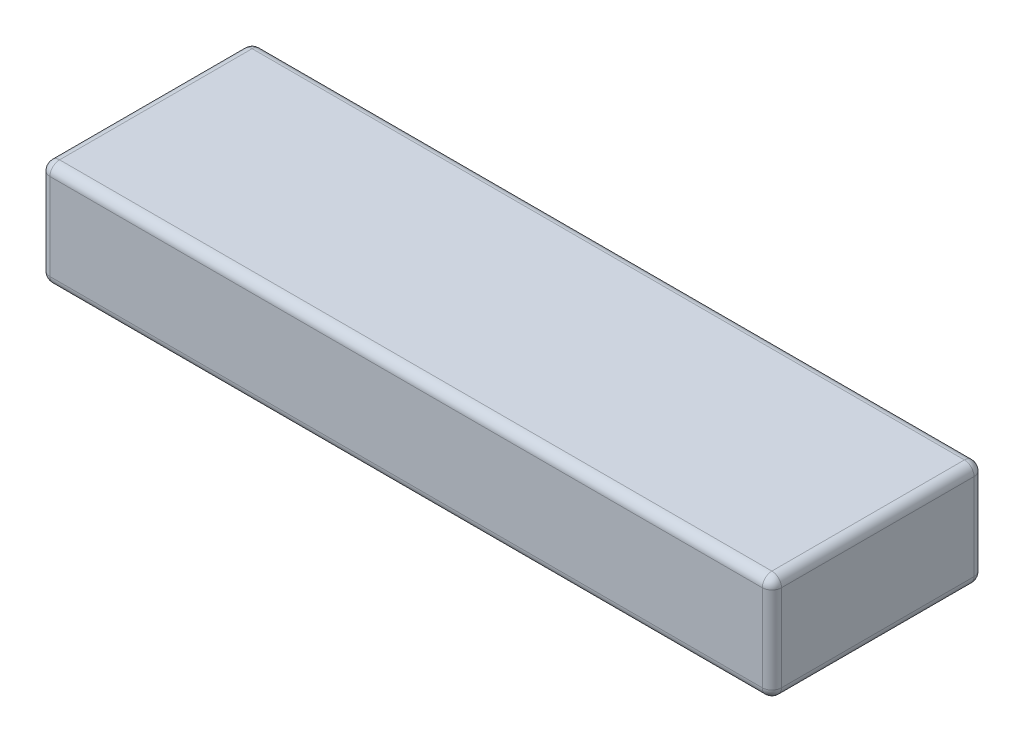
ISO-10303-21;
HEADER;
FILE_DESCRIPTION(('STEP AP214'),'2;1');
FILE_NAME('part.step','',(''),(''),'','','');
FILE_SCHEMA(('AUTOMOTIVE_DESIGN { 1 0 10303 214 1 1 1 1 }'));
ENDSEC;
DATA;
#1=APPLICATION_CONTEXT('core data for automotive mechanical design processes');
#2=APPLICATION_PROTOCOL_DEFINITION('international standard','automotive_design',2000,#1);
#3=PRODUCT_CONTEXT('',#1,'mechanical');
#4=PRODUCT('Part','Part','',(#3));
#5=PRODUCT_RELATED_PRODUCT_CATEGORY('part','',(#4));
#6=PRODUCT_DEFINITION_FORMATION('','',#4);
#7=PRODUCT_DEFINITION_CONTEXT('part definition',#1,'design');
#8=PRODUCT_DEFINITION('design','',#6,#7);
#9=PRODUCT_DEFINITION_SHAPE('','',#8);
#10=(LENGTH_UNIT() NAMED_UNIT(*) SI_UNIT(.MILLI.,.METRE.));
#11=(NAMED_UNIT(*) PLANE_ANGLE_UNIT() SI_UNIT($,.RADIAN.));
#12=(NAMED_UNIT(*) SI_UNIT($,.STERADIAN.) SOLID_ANGLE_UNIT());
#13=UNCERTAINTY_MEASURE_WITH_UNIT(LENGTH_MEASURE(1.E-05),#10,'distance_accuracy_value','');
#14=(GEOMETRIC_REPRESENTATION_CONTEXT(3) GLOBAL_UNCERTAINTY_ASSIGNED_CONTEXT((#13)) GLOBAL_UNIT_ASSIGNED_CONTEXT((#10,
#11,#12)) REPRESENTATION_CONTEXT('',''));
#15=CARTESIAN_POINT('',(0.,0.,0.));
#16=DIRECTION('',(0.,0.,1.));
#17=DIRECTION('',(1.,0.,0.));
#18=AXIS2_PLACEMENT_3D('',#15,#16,#17);
#19=CARTESIAN_POINT('',(76.,22.,22.));
#20=DIRECTION('',(-1.,0.,0.));
#21=DIRECTION('',(0.,0.,1.));
#22=AXIS2_PLACEMENT_3D('',#19,#20,#21);
#23=PLANE('',#22);
#24=DIRECTION('',(0.,0.,-1.));
#25=VECTOR('',#24,1.);
#26=CARTESIAN_POINT('',(76.,2.,-22.));
#27=LINE('',#26,#25);
#28=CARTESIAN_POINT('',(76.,2.,20.));
#29=VERTEX_POINT('',#28);
#30=CARTESIAN_POINT('',(76.,2.,-20.));
#31=VERTEX_POINT('',#30);
#32=EDGE_CURVE('E190',#29,#31,#27,.T.);
#33=ORIENTED_EDGE('',*,*,#32,.T.);
#34=DIRECTION('',(0.,-1.,0.));
#35=VECTOR('',#34,1.);
#36=CARTESIAN_POINT('',(76.,22.,-20.));
#37=LINE('',#36,#35);
#38=CARTESIAN_POINT('',(76.,20.,-20.));
#39=VERTEX_POINT('',#38);
#40=EDGE_CURVE('E193',#31,#39,#37,.F.);
#41=ORIENTED_EDGE('',*,*,#40,.T.);
#42=DIRECTION('',(0.,0.,-1.));
#43=VECTOR('',#42,1.);
#44=CARTESIAN_POINT('',(76.,20.,22.));
#45=LINE('',#44,#43);
#46=CARTESIAN_POINT('',(76.,20.,20.));
#47=VERTEX_POINT('',#46);
#48=EDGE_CURVE('E184',#39,#47,#45,.F.);
#49=ORIENTED_EDGE('',*,*,#48,.T.);
#50=DIRECTION('',(0.,-1.,0.));
#51=VECTOR('',#50,1.);
#52=CARTESIAN_POINT('',(76.,22.,20.));
#53=LINE('',#52,#51);
#54=EDGE_CURVE('E187',#47,#29,#53,.T.);
#55=ORIENTED_EDGE('',*,*,#54,.T.);
#56=EDGE_LOOP('',(#33,#41,#49,#55));
#57=FACE_BOUND('',#56,.T.);
#58=ADVANCED_FACE('F45',(#57),#23,.F.);
#59=CARTESIAN_POINT('',(-76.,22.,-22.));
#60=DIRECTION('',(0.,0.,1.));
#61=DIRECTION('',(1.,0.,0.));
#62=AXIS2_PLACEMENT_3D('',#59,#60,#61);
#63=PLANE('',#62);
#64=DIRECTION('',(0.,-1.,0.));
#65=VECTOR('',#64,1.);
#66=CARTESIAN_POINT('',(74.,22.,-22.));
#67=LINE('',#66,#65);
#68=CARTESIAN_POINT('',(74.,20.,-22.));
#69=VERTEX_POINT('',#68);
#70=CARTESIAN_POINT('',(74.,2.,-22.));
#71=VERTEX_POINT('',#70);
#72=EDGE_CURVE('E146',#69,#71,#67,.T.);
#73=ORIENTED_EDGE('',*,*,#72,.T.);
#74=DIRECTION('',(-1.,0.,0.));
#75=VECTOR('',#74,1.);
#76=CARTESIAN_POINT('',(-76.,2.,-22.));
#77=LINE('',#76,#75);
#78=CARTESIAN_POINT('',(-74.,2.,-22.));
#79=VERTEX_POINT('',#78);
#80=EDGE_CURVE('E141',#71,#79,#77,.T.);
#81=ORIENTED_EDGE('',*,*,#80,.T.);
#82=DIRECTION('',(0.,-1.,0.));
#83=VECTOR('',#82,1.);
#84=CARTESIAN_POINT('',(-74.,22.,-22.));
#85=LINE('',#84,#83);
#86=CARTESIAN_POINT('',(-74.,20.,-22.));
#87=VERTEX_POINT('',#86);
#88=EDGE_CURVE('E133',#79,#87,#85,.F.);
#89=ORIENTED_EDGE('',*,*,#88,.T.);
#90=DIRECTION('',(-1.,0.,0.));
#91=VECTOR('',#90,1.);
#92=CARTESIAN_POINT('',(-76.,20.,-22.));
#93=LINE('',#92,#91);
#94=EDGE_CURVE('E138',#87,#69,#93,.F.);
#95=ORIENTED_EDGE('',*,*,#94,.T.);
#96=EDGE_LOOP('',(#73,#81,#89,#95));
#97=FACE_BOUND('',#96,.T.);
#98=ADVANCED_FACE('F136',(#97),#63,.F.);
#99=CARTESIAN_POINT('',(-76.,22.,22.));
#100=DIRECTION('',(1.,0.,0.));
#101=DIRECTION('',(0.,0.,-1.));
#102=AXIS2_PLACEMENT_3D('',#99,#100,#101);
#103=PLANE('',#102);
#104=DIRECTION('',(0.,0.,1.));
#105=VECTOR('',#104,1.);
#106=CARTESIAN_POINT('',(-76.,20.,22.));
#107=LINE('',#106,#105);
#108=CARTESIAN_POINT('',(-76.,20.,20.));
#109=VERTEX_POINT('',#108);
#110=CARTESIAN_POINT('',(-76.,20.,-20.));
#111=VERTEX_POINT('',#110);
#112=EDGE_CURVE('E197',#109,#111,#107,.F.);
#113=ORIENTED_EDGE('',*,*,#112,.T.);
#114=DIRECTION('',(0.,-1.,0.));
#115=VECTOR('',#114,1.);
#116=CARTESIAN_POINT('',(-76.,22.,-20.));
#117=LINE('',#116,#115);
#118=CARTESIAN_POINT('',(-76.,2.,-20.));
#119=VERTEX_POINT('',#118);
#120=EDGE_CURVE('E154',#111,#119,#117,.T.);
#121=ORIENTED_EDGE('',*,*,#120,.T.);
#122=DIRECTION('',(0.,0.,1.));
#123=VECTOR('',#122,1.);
#124=CARTESIAN_POINT('',(-76.,2.,22.));
#125=LINE('',#124,#123);
#126=CARTESIAN_POINT('',(-76.,2.,20.));
#127=VERTEX_POINT('',#126);
#128=EDGE_CURVE('E203',#119,#127,#125,.T.);
#129=ORIENTED_EDGE('',*,*,#128,.T.);
#130=DIRECTION('',(0.,-1.,0.));
#131=VECTOR('',#130,1.);
#132=CARTESIAN_POINT('',(-76.,22.,20.));
#133=LINE('',#132,#131);
#134=EDGE_CURVE('E200',#127,#109,#133,.F.);
#135=ORIENTED_EDGE('',*,*,#134,.T.);
#136=EDGE_LOOP('',(#113,#121,#129,#135));
#137=FACE_BOUND('',#136,.T.);
#138=ADVANCED_FACE('F384',(#137),#103,.F.);
#139=CARTESIAN_POINT('',(-76.,22.,22.));
#140=DIRECTION('',(0.,0.,-1.));
#141=DIRECTION('',(-1.,0.,0.));
#142=AXIS2_PLACEMENT_3D('',#139,#140,#141);
#143=PLANE('',#142);
#144=DIRECTION('',(0.,-1.,0.));
#145=VECTOR('',#144,1.);
#146=CARTESIAN_POINT('',(-74.,22.,22.));
#147=LINE('',#146,#145);
#148=CARTESIAN_POINT('',(-74.,20.,22.));
#149=VERTEX_POINT('',#148);
#150=CARTESIAN_POINT('',(-74.,2.,22.));
#151=VERTEX_POINT('',#150);
#152=EDGE_CURVE('E227',#149,#151,#147,.T.);
#153=ORIENTED_EDGE('',*,*,#152,.T.);
#154=DIRECTION('',(1.,0.,0.));
#155=VECTOR('',#154,1.);
#156=CARTESIAN_POINT('',(76.,2.,22.));
#157=LINE('',#156,#155);
#158=CARTESIAN_POINT('',(74.,2.,22.));
#159=VERTEX_POINT('',#158);
#160=EDGE_CURVE('E231',#151,#159,#157,.T.);
#161=ORIENTED_EDGE('',*,*,#160,.T.);
#162=DIRECTION('',(0.,-1.,0.));
#163=VECTOR('',#162,1.);
#164=CARTESIAN_POINT('',(74.,22.,22.));
#165=LINE('',#164,#163);
#166=CARTESIAN_POINT('',(74.,20.,22.));
#167=VERTEX_POINT('',#166);
#168=EDGE_CURVE('E224',#159,#167,#165,.F.);
#169=ORIENTED_EDGE('',*,*,#168,.T.);
#170=DIRECTION('',(1.,0.,0.));
#171=VECTOR('',#170,1.);
#172=CARTESIAN_POINT('',(-76.,20.,22.));
#173=LINE('',#172,#171);
#174=EDGE_CURVE('E221',#167,#149,#173,.F.);
#175=ORIENTED_EDGE('',*,*,#174,.T.);
#176=EDGE_LOOP('',(#153,#161,#169,#175));
#177=FACE_BOUND('',#176,.T.);
#178=ADVANCED_FACE('F333',(#177),#143,.F.);
#179=CARTESIAN_POINT('',(0.,22.,0.));
#180=DIRECTION('',(0.,-1.,0.));
#181=DIRECTION('',(0.,0.,-1.));
#182=AXIS2_PLACEMENT_3D('',#179,#180,#181);
#183=PLANE('',#182);
#184=DIRECTION('',(0.,0.,1.));
#185=VECTOR('',#184,1.);
#186=CARTESIAN_POINT('',(-74.,22.,0.));
#187=LINE('',#186,#185);
#188=CARTESIAN_POINT('',(-74.,22.,-20.));
#189=VERTEX_POINT('',#188);
#190=CARTESIAN_POINT('',(-74.,22.,20.));
#191=VERTEX_POINT('',#190);
#192=EDGE_CURVE('E55',#189,#191,#187,.T.);
#193=ORIENTED_EDGE('',*,*,#192,.T.);
#194=DIRECTION('',(1.,0.,0.));
#195=VECTOR('',#194,1.);
#196=CARTESIAN_POINT('',(0.,22.,20.));
#197=LINE('',#196,#195);
#198=CARTESIAN_POINT('',(74.,22.,20.));
#199=VERTEX_POINT('',#198);
#200=EDGE_CURVE('E11',#191,#199,#197,.T.);
#201=ORIENTED_EDGE('',*,*,#200,.T.);
#202=DIRECTION('',(0.,0.,-1.));
#203=VECTOR('',#202,1.);
#204=CARTESIAN_POINT('',(74.,22.,0.));
#205=LINE('',#204,#203);
#206=CARTESIAN_POINT('',(74.,22.,-20.));
#207=VERTEX_POINT('',#206);
#208=EDGE_CURVE('E234',#199,#207,#205,.T.);
#209=ORIENTED_EDGE('',*,*,#208,.T.);
#210=DIRECTION('',(-1.,0.,0.));
#211=VECTOR('',#210,1.);
#212=CARTESIAN_POINT('',(0.,22.,-20.));
#213=LINE('',#212,#211);
#214=EDGE_CURVE('E66',#207,#189,#213,.T.);
#215=ORIENTED_EDGE('',*,*,#214,.T.);
#216=EDGE_LOOP('',(#193,#201,#209,#215));
#217=FACE_BOUND('',#216,.T.);
#218=ADVANCED_FACE('F348',(#217),#183,.F.);
#219=CARTESIAN_POINT('',(0.,0.,0.));
#220=DIRECTION('',(0.,-1.,0.));
#221=DIRECTION('',(0.,0.,-1.));
#222=AXIS2_PLACEMENT_3D('',#219,#220,#221);
#223=PLANE('',#222);
#224=DIRECTION('',(0.,0.,1.));
#225=VECTOR('',#224,1.);
#226=CARTESIAN_POINT('',(-74.,0.,-22.));
#227=LINE('',#226,#225);
#228=CARTESIAN_POINT('',(-74.,0.,20.));
#229=VERTEX_POINT('',#228);
#230=CARTESIAN_POINT('',(-74.,0.,-20.));
#231=VERTEX_POINT('',#230);
#232=EDGE_CURVE('E214',#229,#231,#227,.F.);
#233=ORIENTED_EDGE('',*,*,#232,.T.);
#234=DIRECTION('',(-1.,0.,0.));
#235=VECTOR('',#234,1.);
#236=CARTESIAN_POINT('',(76.,0.,-20.));
#237=LINE('',#236,#235);
#238=CARTESIAN_POINT('',(74.,0.,-20.));
#239=VERTEX_POINT('',#238);
#240=EDGE_CURVE('E217',#231,#239,#237,.F.);
#241=ORIENTED_EDGE('',*,*,#240,.T.);
#242=DIRECTION('',(0.,0.,-1.));
#243=VECTOR('',#242,1.);
#244=CARTESIAN_POINT('',(74.,0.,22.));
#245=LINE('',#244,#243);
#246=CARTESIAN_POINT('',(74.,0.,20.));
#247=VERTEX_POINT('',#246);
#248=EDGE_CURVE('E211',#239,#247,#245,.F.);
#249=ORIENTED_EDGE('',*,*,#248,.T.);
#250=DIRECTION('',(1.,0.,0.));
#251=VECTOR('',#250,1.);
#252=CARTESIAN_POINT('',(-76.,0.,20.));
#253=LINE('',#252,#251);
#254=EDGE_CURVE('E208',#247,#229,#253,.F.);
#255=ORIENTED_EDGE('',*,*,#254,.T.);
#256=EDGE_LOOP('',(#233,#241,#249,#255));
#257=FACE_BOUND('',#256,.T.);
#258=ADVANCED_FACE('F324',(#257),#223,.T.);
#259=CARTESIAN_POINT('',(-74.,22.,20.));
#260=DIRECTION('',(0.,-1.,0.));
#261=DIRECTION('',(0.,0.,-1.));
#262=AXIS2_PLACEMENT_3D('',#259,#260,#261);
#263=CYLINDRICAL_SURFACE('',#262,2.);
#264=CARTESIAN_POINT('',(-74.,20.,20.));
#265=DIRECTION('',(0.,1.,0.));
#266=DIRECTION('',(0.,0.,1.));
#267=AXIS2_PLACEMENT_3D('',#264,#265,#266);
#268=CIRCLE('',#267,2.);
#269=EDGE_CURVE('E49',#109,#149,#268,.T.);
#270=ORIENTED_EDGE('',*,*,#269,.F.);
#271=ORIENTED_EDGE('',*,*,#134,.F.);
#272=CARTESIAN_POINT('',(-74.,2.,20.));
#273=DIRECTION('',(0.,-1.,0.));
#274=DIRECTION('',(0.,0.,-1.));
#275=AXIS2_PLACEMENT_3D('',#272,#273,#274);
#276=CIRCLE('',#275,2.);
#277=EDGE_CURVE('E178',#151,#127,#276,.T.);
#278=ORIENTED_EDGE('',*,*,#277,.F.);
#279=ORIENTED_EDGE('',*,*,#152,.F.);
#280=EDGE_LOOP('',(#270,#271,#278,#279));
#281=FACE_BOUND('',#280,.T.);
#282=ADVANCED_FACE('F47',(#281),#263,.T.);
#283=CARTESIAN_POINT('',(-74.,20.,20.));
#284=DIRECTION('',(0.,0.,1.));
#285=DIRECTION('',(1.,0.,0.));
#286=AXIS2_PLACEMENT_3D('',#283,#284,#285);
#287=SPHERICAL_SURFACE('',#286,2.);
#288=CARTESIAN_POINT('',(-74.,20.,20.));
#289=DIRECTION('',(0.,0.,1.));
#290=DIRECTION('',(1.,0.,0.));
#291=AXIS2_PLACEMENT_3D('',#288,#289,#290);
#292=CIRCLE('',#291,2.);
#293=EDGE_CURVE('E301',#109,#191,#292,.F.);
#294=ORIENTED_EDGE('',*,*,#293,.F.);
#295=ORIENTED_EDGE('',*,*,#269,.T.);
#296=CARTESIAN_POINT('',(-74.,20.,20.));
#297=DIRECTION('',(-1.,0.,0.));
#298=DIRECTION('',(0.,0.,1.));
#299=AXIS2_PLACEMENT_3D('',#296,#297,#298);
#300=CIRCLE('',#299,2.);
#301=EDGE_CURVE('E304',#191,#149,#300,.F.);
#302=ORIENTED_EDGE('',*,*,#301,.F.);
#303=EDGE_LOOP('',(#294,#295,#302));
#304=FACE_BOUND('',#303,.T.);
#305=ADVANCED_FACE('F552',(#304),#287,.T.);
#306=CARTESIAN_POINT('',(-74.,2.,20.));
#307=DIRECTION('',(-1.,0.,0.));
#308=DIRECTION('',(0.,-1.,0.));
#309=AXIS2_PLACEMENT_3D('',#306,#307,#308);
#310=SPHERICAL_SURFACE('',#309,2.);
#311=CARTESIAN_POINT('',(-74.,2.,20.));
#312=DIRECTION('',(-1.,0.,0.));
#313=DIRECTION('',(0.,0.,1.));
#314=AXIS2_PLACEMENT_3D('',#311,#312,#313);
#315=CIRCLE('',#314,2.);
#316=EDGE_CURVE('E293',#151,#229,#315,.F.);
#317=ORIENTED_EDGE('',*,*,#316,.F.);
#318=ORIENTED_EDGE('',*,*,#277,.T.);
#319=CARTESIAN_POINT('',(-74.,2.,20.));
#320=DIRECTION('',(0.,0.,1.));
#321=DIRECTION('',(1.,0.,0.));
#322=AXIS2_PLACEMENT_3D('',#319,#320,#321);
#323=CIRCLE('',#322,2.);
#324=EDGE_CURVE('E297',#229,#127,#323,.F.);
#325=ORIENTED_EDGE('',*,*,#324,.F.);
#326=EDGE_LOOP('',(#317,#318,#325));
#327=FACE_BOUND('',#326,.T.);
#328=ADVANCED_FACE('F313',(#327),#310,.T.);
#329=CARTESIAN_POINT('',(0.,20.,20.));
#330=DIRECTION('',(1.,0.,0.));
#331=DIRECTION('',(0.,0.,-1.));
#332=AXIS2_PLACEMENT_3D('',#329,#330,#331);
#333=CYLINDRICAL_SURFACE('',#332,2.);
#334=ORIENTED_EDGE('',*,*,#301,.T.);
#335=ORIENTED_EDGE('',*,*,#174,.F.);
#336=CARTESIAN_POINT('',(74.,20.,20.));
#337=DIRECTION('',(1.,0.,0.));
#338=DIRECTION('',(0.,0.,-1.));
#339=AXIS2_PLACEMENT_3D('',#336,#337,#338);
#340=CIRCLE('',#339,2.);
#341=EDGE_CURVE('E285',#199,#167,#340,.T.);
#342=ORIENTED_EDGE('',*,*,#341,.F.);
#343=ORIENTED_EDGE('',*,*,#200,.F.);
#344=EDGE_LOOP('',(#334,#335,#342,#343));
#345=FACE_BOUND('',#344,.T.);
#346=ADVANCED_FACE('F347',(#345),#333,.T.);
#347=CARTESIAN_POINT('',(-74.,20.,0.));
#348=DIRECTION('',(0.,0.,1.));
#349=DIRECTION('',(1.,0.,0.));
#350=AXIS2_PLACEMENT_3D('',#347,#348,#349);
#351=CYLINDRICAL_SURFACE('',#350,2.);
#352=ORIENTED_EDGE('',*,*,#293,.T.);
#353=ORIENTED_EDGE('',*,*,#192,.F.);
#354=CARTESIAN_POINT('',(-74.,20.,-20.));
#355=DIRECTION('',(0.,0.,-1.));
#356=DIRECTION('',(0.,1.,0.));
#357=AXIS2_PLACEMENT_3D('',#354,#355,#356);
#358=CIRCLE('',#357,2.);
#359=EDGE_CURVE('E159',#111,#189,#358,.T.);
#360=ORIENTED_EDGE('',*,*,#359,.F.);
#361=ORIENTED_EDGE('',*,*,#112,.F.);
#362=EDGE_LOOP('',(#352,#353,#360,#361));
#363=FACE_BOUND('',#362,.T.);
#364=ADVANCED_FACE('F523',(#363),#351,.T.);
#365=CARTESIAN_POINT('',(-74.,22.,-20.));
#366=DIRECTION('',(0.,-1.,0.));
#367=DIRECTION('',(0.,0.,-1.));
#368=AXIS2_PLACEMENT_3D('',#365,#366,#367);
#369=CYLINDRICAL_SURFACE('',#368,2.);
#370=CARTESIAN_POINT('',(-74.,2.,-20.));
#371=DIRECTION('',(0.,-1.,0.));
#372=DIRECTION('',(0.,0.,-1.));
#373=AXIS2_PLACEMENT_3D('',#370,#371,#372);
#374=CIRCLE('',#373,2.);
#375=EDGE_CURVE('E160',#119,#79,#374,.T.);
#376=ORIENTED_EDGE('',*,*,#375,.F.);
#377=ORIENTED_EDGE('',*,*,#120,.F.);
#378=CARTESIAN_POINT('',(-74.,20.,-20.));
#379=DIRECTION('',(0.,1.,0.));
#380=DIRECTION('',(0.,0.,1.));
#381=AXIS2_PLACEMENT_3D('',#378,#379,#380);
#382=CIRCLE('',#381,2.);
#383=EDGE_CURVE('E150',#87,#111,#382,.T.);
#384=ORIENTED_EDGE('',*,*,#383,.F.);
#385=ORIENTED_EDGE('',*,*,#88,.F.);
#386=EDGE_LOOP('',(#376,#377,#384,#385));
#387=FACE_BOUND('',#386,.T.);
#388=ADVANCED_FACE('F152',(#387),#369,.T.);
#389=CARTESIAN_POINT('',(-74.,2.,22.));
#390=DIRECTION('',(0.,0.,-1.));
#391=DIRECTION('',(-1.,0.,0.));
#392=AXIS2_PLACEMENT_3D('',#389,#390,#391);
#393=CYLINDRICAL_SURFACE('',#392,2.);
#394=ORIENTED_EDGE('',*,*,#324,.T.);
#395=ORIENTED_EDGE('',*,*,#128,.F.);
#396=CARTESIAN_POINT('',(-74.,2.,-20.));
#397=DIRECTION('',(0.,0.,-1.));
#398=DIRECTION('',(-1.,0.,0.));
#399=AXIS2_PLACEMENT_3D('',#396,#397,#398);
#400=CIRCLE('',#399,2.);
#401=EDGE_CURVE('E278',#231,#119,#400,.T.);
#402=ORIENTED_EDGE('',*,*,#401,.F.);
#403=ORIENTED_EDGE('',*,*,#232,.F.);
#404=EDGE_LOOP('',(#394,#395,#402,#403));
#405=FACE_BOUND('',#404,.T.);
#406=ADVANCED_FACE('F320',(#405),#393,.T.);
#407=CARTESIAN_POINT('',(-76.,2.,20.));
#408=DIRECTION('',(-1.,0.,0.));
#409=DIRECTION('',(0.,0.,1.));
#410=AXIS2_PLACEMENT_3D('',#407,#408,#409);
#411=CYLINDRICAL_SURFACE('',#410,2.);
#412=ORIENTED_EDGE('',*,*,#316,.T.);
#413=ORIENTED_EDGE('',*,*,#254,.F.);
#414=CARTESIAN_POINT('',(74.,2.,20.));
#415=DIRECTION('',(1.,0.,0.));
#416=DIRECTION('',(0.,0.,-1.));
#417=AXIS2_PLACEMENT_3D('',#414,#415,#416);
#418=CIRCLE('',#417,2.);
#419=EDGE_CURVE('E274',#159,#247,#418,.T.);
#420=ORIENTED_EDGE('',*,*,#419,.F.);
#421=ORIENTED_EDGE('',*,*,#160,.F.);
#422=EDGE_LOOP('',(#412,#413,#420,#421));
#423=FACE_BOUND('',#422,.T.);
#424=ADVANCED_FACE('F330',(#423),#411,.T.);
#425=CARTESIAN_POINT('',(74.,22.,20.));
#426=DIRECTION('',(0.,-1.,0.));
#427=DIRECTION('',(0.,0.,-1.));
#428=AXIS2_PLACEMENT_3D('',#425,#426,#427);
#429=CYLINDRICAL_SURFACE('',#428,2.);
#430=CARTESIAN_POINT('',(74.,20.,20.));
#431=DIRECTION('',(0.,1.,0.));
#432=DIRECTION('',(0.,0.,1.));
#433=AXIS2_PLACEMENT_3D('',#430,#431,#432);
#434=CIRCLE('',#433,2.);
#435=EDGE_CURVE('E289',#167,#47,#434,.T.);
#436=ORIENTED_EDGE('',*,*,#435,.F.);
#437=ORIENTED_EDGE('',*,*,#168,.F.);
#438=CARTESIAN_POINT('',(74.,2.,20.));
#439=DIRECTION('',(0.,-1.,0.));
#440=DIRECTION('',(0.,0.,-1.));
#441=AXIS2_PLACEMENT_3D('',#438,#439,#440);
#442=CIRCLE('',#441,2.);
#443=EDGE_CURVE('E270',#29,#159,#442,.T.);
#444=ORIENTED_EDGE('',*,*,#443,.F.);
#445=ORIENTED_EDGE('',*,*,#54,.F.);
#446=EDGE_LOOP('',(#436,#437,#444,#445));
#447=FACE_BOUND('',#446,.T.);
#448=ADVANCED_FACE('F338',(#447),#429,.T.);
#449=CARTESIAN_POINT('',(74.,20.,20.));
#450=DIRECTION('',(0.,0.,1.));
#451=DIRECTION('',(1.,0.,0.));
#452=AXIS2_PLACEMENT_3D('',#449,#450,#451);
#453=SPHERICAL_SURFACE('',#452,2.);
#454=ORIENTED_EDGE('',*,*,#341,.T.);
#455=ORIENTED_EDGE('',*,*,#435,.T.);
#456=CARTESIAN_POINT('',(74.,20.,20.));
#457=DIRECTION('',(0.,0.,1.));
#458=DIRECTION('',(1.,0.,0.));
#459=AXIS2_PLACEMENT_3D('',#456,#457,#458);
#460=CIRCLE('',#459,2.);
#461=EDGE_CURVE('E167',#199,#47,#460,.F.);
#462=ORIENTED_EDGE('',*,*,#461,.F.);
#463=EDGE_LOOP('',(#454,#455,#462));
#464=FACE_BOUND('',#463,.T.);
#465=ADVANCED_FACE('F344',(#464),#453,.T.);
#466=CARTESIAN_POINT('',(-74.,20.,-20.));
#467=DIRECTION('',(-1.,0.,0.));
#468=DIRECTION('',(0.,0.,1.));
#469=AXIS2_PLACEMENT_3D('',#466,#467,#468);
#470=SPHERICAL_SURFACE('',#469,2.);
#471=ORIENTED_EDGE('',*,*,#383,.T.);
#472=ORIENTED_EDGE('',*,*,#359,.T.);
#473=CARTESIAN_POINT('',(-74.,20.,-20.));
#474=DIRECTION('',(-1.,0.,0.));
#475=DIRECTION('',(0.,0.,1.));
#476=AXIS2_PLACEMENT_3D('',#473,#474,#475);
#477=CIRCLE('',#476,2.);
#478=EDGE_CURVE('E163',#87,#189,#477,.F.);
#479=ORIENTED_EDGE('',*,*,#478,.F.);
#480=EDGE_LOOP('',(#471,#472,#479));
#481=FACE_BOUND('',#480,.T.);
#482=ADVANCED_FACE('F164',(#481),#470,.T.);
#483=CARTESIAN_POINT('',(-74.,2.,-20.));
#484=DIRECTION('',(-1.,0.,0.));
#485=DIRECTION('',(0.,0.,1.));
#486=AXIS2_PLACEMENT_3D('',#483,#484,#485);
#487=SPHERICAL_SURFACE('',#486,2.);
#488=ORIENTED_EDGE('',*,*,#401,.T.);
#489=ORIENTED_EDGE('',*,*,#375,.T.);
#490=CARTESIAN_POINT('',(-74.,2.,-20.));
#491=DIRECTION('',(-1.,0.,0.));
#492=DIRECTION('',(0.,0.,1.));
#493=AXIS2_PLACEMENT_3D('',#490,#491,#492);
#494=CIRCLE('',#493,2.);
#495=EDGE_CURVE('E168',#231,#79,#494,.F.);
#496=ORIENTED_EDGE('',*,*,#495,.F.);
#497=EDGE_LOOP('',(#488,#489,#496));
#498=FACE_BOUND('',#497,.T.);
#499=ADVANCED_FACE('F367',(#498),#487,.T.);
#500=CARTESIAN_POINT('',(74.,2.,20.));
#501=DIRECTION('',(0.,0.,1.));
#502=DIRECTION('',(0.,-1.,0.));
#503=AXIS2_PLACEMENT_3D('',#500,#501,#502);
#504=SPHERICAL_SURFACE('',#503,2.);
#505=ORIENTED_EDGE('',*,*,#443,.T.);
#506=ORIENTED_EDGE('',*,*,#419,.T.);
#507=CARTESIAN_POINT('',(74.,2.,20.));
#508=DIRECTION('',(0.,0.,1.));
#509=DIRECTION('',(1.,0.,0.));
#510=AXIS2_PLACEMENT_3D('',#507,#508,#509);
#511=CIRCLE('',#510,2.);
#512=EDGE_CURVE('E260',#29,#247,#511,.F.);
#513=ORIENTED_EDGE('',*,*,#512,.F.);
#514=EDGE_LOOP('',(#505,#506,#513));
#515=FACE_BOUND('',#514,.T.);
#516=ADVANCED_FACE('F369',(#515),#504,.T.);
#517=CARTESIAN_POINT('',(74.,20.,0.));
#518=DIRECTION('',(0.,0.,-1.));
#519=DIRECTION('',(-1.,0.,0.));
#520=AXIS2_PLACEMENT_3D('',#517,#518,#519);
#521=CYLINDRICAL_SURFACE('',#520,2.);
#522=ORIENTED_EDGE('',*,*,#461,.T.);
#523=ORIENTED_EDGE('',*,*,#48,.F.);
#524=CARTESIAN_POINT('',(74.,20.,-20.));
#525=DIRECTION('',(0.,0.,-1.));
#526=DIRECTION('',(-1.,0.,0.));
#527=AXIS2_PLACEMENT_3D('',#524,#525,#526);
#528=CIRCLE('',#527,2.);
#529=EDGE_CURVE('E256',#207,#39,#528,.T.);
#530=ORIENTED_EDGE('',*,*,#529,.F.);
#531=ORIENTED_EDGE('',*,*,#208,.F.);
#532=EDGE_LOOP('',(#522,#523,#530,#531));
#533=FACE_BOUND('',#532,.T.);
#534=ADVANCED_FACE('F352',(#533),#521,.T.);
#535=CARTESIAN_POINT('',(0.,20.,-20.));
#536=DIRECTION('',(-1.,0.,0.));
#537=DIRECTION('',(0.,0.,1.));
#538=AXIS2_PLACEMENT_3D('',#535,#536,#537);
#539=CYLINDRICAL_SURFACE('',#538,2.);
#540=ORIENTED_EDGE('',*,*,#478,.T.);
#541=ORIENTED_EDGE('',*,*,#214,.F.);
#542=CARTESIAN_POINT('',(74.,20.,-20.));
#543=DIRECTION('',(1.,0.,0.));
#544=DIRECTION('',(0.,0.,-1.));
#545=AXIS2_PLACEMENT_3D('',#542,#543,#544);
#546=CIRCLE('',#545,2.);
#547=EDGE_CURVE('E172',#69,#207,#546,.T.);
#548=ORIENTED_EDGE('',*,*,#547,.F.);
#549=ORIENTED_EDGE('',*,*,#94,.F.);
#550=EDGE_LOOP('',(#540,#541,#548,#549));
#551=FACE_BOUND('',#550,.T.);
#552=ADVANCED_FACE('F170',(#551),#539,.T.);
#553=CARTESIAN_POINT('',(-76.,2.,-20.));
#554=DIRECTION('',(1.,0.,0.));
#555=DIRECTION('',(0.,0.,-1.));
#556=AXIS2_PLACEMENT_3D('',#553,#554,#555);
#557=CYLINDRICAL_SURFACE('',#556,2.);
#558=ORIENTED_EDGE('',*,*,#495,.T.);
#559=ORIENTED_EDGE('',*,*,#80,.F.);
#560=CARTESIAN_POINT('',(74.,2.,-20.));
#561=DIRECTION('',(1.,0.,0.));
#562=DIRECTION('',(0.,0.,-1.));
#563=AXIS2_PLACEMENT_3D('',#560,#561,#562);
#564=CIRCLE('',#563,2.);
#565=EDGE_CURVE('E250',#239,#71,#564,.T.);
#566=ORIENTED_EDGE('',*,*,#565,.F.);
#567=ORIENTED_EDGE('',*,*,#240,.F.);
#568=EDGE_LOOP('',(#558,#559,#566,#567));
#569=FACE_BOUND('',#568,.T.);
#570=ADVANCED_FACE('F365',(#569),#557,.T.);
#571=CARTESIAN_POINT('',(74.,2.,22.));
#572=DIRECTION('',(0.,0.,1.));
#573=DIRECTION('',(1.,0.,0.));
#574=AXIS2_PLACEMENT_3D('',#571,#572,#573);
#575=CYLINDRICAL_SURFACE('',#574,2.);
#576=ORIENTED_EDGE('',*,*,#512,.T.);
#577=ORIENTED_EDGE('',*,*,#248,.F.);
#578=CARTESIAN_POINT('',(74.,2.,-20.));
#579=DIRECTION('',(0.,0.,-1.));
#580=DIRECTION('',(-1.,0.,0.));
#581=AXIS2_PLACEMENT_3D('',#578,#579,#580);
#582=CIRCLE('',#581,2.);
#583=EDGE_CURVE('E247',#31,#239,#582,.T.);
#584=ORIENTED_EDGE('',*,*,#583,.F.);
#585=ORIENTED_EDGE('',*,*,#32,.F.);
#586=EDGE_LOOP('',(#576,#577,#584,#585));
#587=FACE_BOUND('',#586,.T.);
#588=ADVANCED_FACE('F394',(#587),#575,.T.);
#589=CARTESIAN_POINT('',(74.,20.,-20.));
#590=DIRECTION('',(0.,1.,0.));
#591=DIRECTION('',(0.,0.,1.));
#592=AXIS2_PLACEMENT_3D('',#589,#590,#591);
#593=SPHERICAL_SURFACE('',#592,2.);
#594=ORIENTED_EDGE('',*,*,#547,.T.);
#595=ORIENTED_EDGE('',*,*,#529,.T.);
#596=CARTESIAN_POINT('',(74.,20.,-20.));
#597=DIRECTION('',(0.,1.,0.));
#598=DIRECTION('',(0.,0.,1.));
#599=AXIS2_PLACEMENT_3D('',#596,#597,#598);
#600=CIRCLE('',#599,2.);
#601=EDGE_CURVE('E244',#69,#39,#600,.F.);
#602=ORIENTED_EDGE('',*,*,#601,.F.);
#603=EDGE_LOOP('',(#594,#595,#602));
#604=FACE_BOUND('',#603,.T.);
#605=ADVANCED_FACE('F354',(#604),#593,.T.);
#606=CARTESIAN_POINT('',(74.,2.,-20.));
#607=DIRECTION('',(0.,-1.,0.));
#608=DIRECTION('',(0.,0.,-1.));
#609=AXIS2_PLACEMENT_3D('',#606,#607,#608);
#610=SPHERICAL_SURFACE('',#609,2.);
#611=ORIENTED_EDGE('',*,*,#583,.T.);
#612=ORIENTED_EDGE('',*,*,#565,.T.);
#613=CARTESIAN_POINT('',(74.,2.,-20.));
#614=DIRECTION('',(0.,-1.,0.));
#615=DIRECTION('',(0.,0.,-1.));
#616=AXIS2_PLACEMENT_3D('',#613,#614,#615);
#617=CIRCLE('',#616,2.);
#618=EDGE_CURVE('E241',#31,#71,#617,.F.);
#619=ORIENTED_EDGE('',*,*,#618,.F.);
#620=EDGE_LOOP('',(#611,#612,#619));
#621=FACE_BOUND('',#620,.T.);
#622=ADVANCED_FACE('F362',(#621),#610,.T.);
#623=CARTESIAN_POINT('',(74.,22.,-20.));
#624=DIRECTION('',(0.,-1.,0.));
#625=DIRECTION('',(0.,0.,-1.));
#626=AXIS2_PLACEMENT_3D('',#623,#624,#625);
#627=CYLINDRICAL_SURFACE('',#626,2.);
#628=ORIENTED_EDGE('',*,*,#601,.T.);
#629=ORIENTED_EDGE('',*,*,#40,.F.);
#630=ORIENTED_EDGE('',*,*,#618,.T.);
#631=ORIENTED_EDGE('',*,*,#72,.F.);
#632=EDGE_LOOP('',(#628,#629,#630,#631));
#633=FACE_BOUND('',#632,.T.);
#634=ADVANCED_FACE('F358',(#633),#627,.T.);
#635=CLOSED_SHELL('',(#58,#98,#138,#178,#218,#258,#282,#305,#328,#346,#364,#388,#406,#424,#448,
#465,#482,#499,#516,#534,#552,#570,#588,#605,#622,#634));
#636=MANIFOLD_SOLID_BREP('B2',#635);
#637=ADVANCED_BREP_SHAPE_REPRESENTATION('',(#18,#636),#14);
#638=SHAPE_DEFINITION_REPRESENTATION(#9,#637);
ENDSEC;
END-ISO-10303-21;
